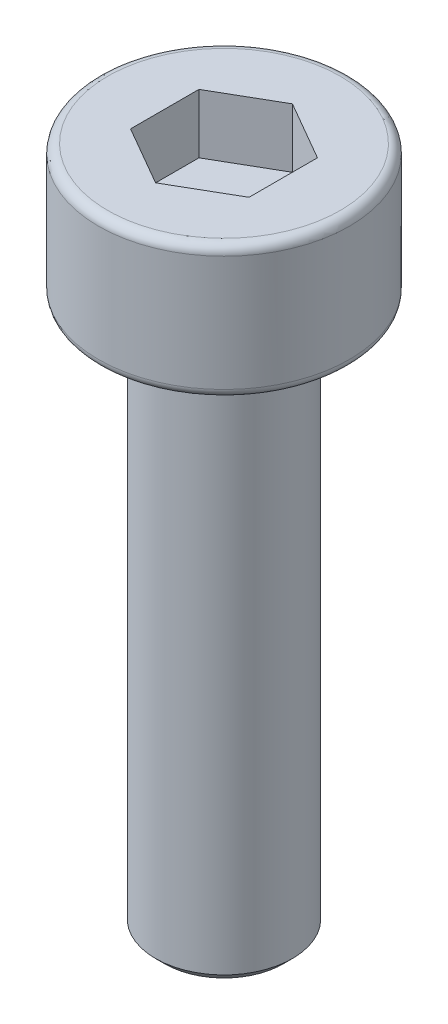
ISO-10303-21;
HEADER;
FILE_DESCRIPTION(('STEP AP214'),'2;1');
FILE_NAME('part.step','',(''),(''),'','','');
FILE_SCHEMA(('AUTOMOTIVE_DESIGN { 1 0 10303 214 1 1 1 1 }'));
ENDSEC;
DATA;
#1=APPLICATION_CONTEXT('core data for automotive mechanical design processes');
#2=APPLICATION_PROTOCOL_DEFINITION('international standard','automotive_design',2000,#1);
#3=PRODUCT_CONTEXT('',#1,'mechanical');
#4=PRODUCT('Part','Part','',(#3));
#5=PRODUCT_RELATED_PRODUCT_CATEGORY('part','',(#4));
#6=PRODUCT_DEFINITION_FORMATION('','',#4);
#7=PRODUCT_DEFINITION_CONTEXT('part definition',#1,'design');
#8=PRODUCT_DEFINITION('design','',#6,#7);
#9=PRODUCT_DEFINITION_SHAPE('','',#8);
#10=(LENGTH_UNIT() NAMED_UNIT(*) SI_UNIT(.MILLI.,.METRE.));
#11=(NAMED_UNIT(*) PLANE_ANGLE_UNIT() SI_UNIT($,.RADIAN.));
#12=(NAMED_UNIT(*) SI_UNIT($,.STERADIAN.) SOLID_ANGLE_UNIT());
#13=UNCERTAINTY_MEASURE_WITH_UNIT(LENGTH_MEASURE(1.E-05),#10,'distance_accuracy_value','');
#14=(GEOMETRIC_REPRESENTATION_CONTEXT(3) GLOBAL_UNCERTAINTY_ASSIGNED_CONTEXT((#13)) GLOBAL_UNIT_ASSIGNED_CONTEXT((#10,
#11,#12)) REPRESENTATION_CONTEXT('',''));
#15=CARTESIAN_POINT('',(0.,0.,0.));
#16=DIRECTION('',(0.,0.,1.));
#17=DIRECTION('',(1.,0.,0.));
#18=AXIS2_PLACEMENT_3D('',#15,#16,#17);
#19=CARTESIAN_POINT('',(0.,0.,0.));
#20=DIRECTION('',(0.,-1.,0.));
#21=DIRECTION('',(0.,0.,-1.));
#22=AXIS2_PLACEMENT_3D('',#19,#20,#21);
#23=PLANE('',#22);
#24=CARTESIAN_POINT('',(0.,0.,0.));
#25=DIRECTION('',(0.,-1.,0.));
#26=DIRECTION('',(0.,0.,-1.));
#27=AXIS2_PLACEMENT_3D('',#24,#25,#26);
#28=CIRCLE('',#27,2.55);
#29=CARTESIAN_POINT('',(0.,0.,-2.55));
#30=VERTEX_POINT('',#29);
#31=EDGE_CURVE('E157',#30,#30,#28,.F.);
#32=ORIENTED_EDGE('',*,*,#31,.T.);
#33=EDGE_LOOP('',(#32));
#34=FACE_BOUND('',#33,.T.);
#35=DIRECTION('',(-0.866025403784438,0.,0.5));
#36=VECTOR('',#35,1.);
#37=CARTESIAN_POINT('',(0.,0.,-1.5));
#38=LINE('',#37,#36);
#39=CARTESIAN_POINT('',(0.,0.,-1.5));
#40=VERTEX_POINT('',#39);
#41=CARTESIAN_POINT('',(-1.29903810567666,0.,-0.75));
#42=VERTEX_POINT('',#41);
#43=EDGE_CURVE('E136',#40,#42,#38,.T.);
#44=ORIENTED_EDGE('',*,*,#43,.F.);
#45=DIRECTION('',(-0.866025403784439,0.,-0.5));
#46=VECTOR('',#45,1.);
#47=CARTESIAN_POINT('',(1.29903810567666,0.,-0.750000000000001));
#48=LINE('',#47,#46);
#49=CARTESIAN_POINT('',(1.29903810567666,0.,-0.750000000000001));
#50=VERTEX_POINT('',#49);
#51=EDGE_CURVE('E62',#50,#40,#48,.T.);
#52=ORIENTED_EDGE('',*,*,#51,.F.);
#53=DIRECTION('',(0.,0.,-1.));
#54=VECTOR('',#53,1.);
#55=CARTESIAN_POINT('',(1.29903810567666,0.,0.75));
#56=LINE('',#55,#54);
#57=CARTESIAN_POINT('',(1.29903810567666,0.,0.75));
#58=VERTEX_POINT('',#57);
#59=EDGE_CURVE('E145',#58,#50,#56,.T.);
#60=ORIENTED_EDGE('',*,*,#59,.F.);
#61=DIRECTION('',(0.866025403784439,0.,-0.5));
#62=VECTOR('',#61,1.);
#63=CARTESIAN_POINT('',(0.,0.,1.5));
#64=LINE('',#63,#62);
#65=CARTESIAN_POINT('',(0.,0.,1.5));
#66=VERTEX_POINT('',#65);
#67=EDGE_CURVE('E143',#66,#58,#64,.T.);
#68=ORIENTED_EDGE('',*,*,#67,.F.);
#69=DIRECTION('',(0.866025403784439,0.,0.5));
#70=VECTOR('',#69,1.);
#71=CARTESIAN_POINT('',(-1.29903810567666,0.,0.75));
#72=LINE('',#71,#70);
#73=CARTESIAN_POINT('',(-1.29903810567666,0.,0.75));
#74=VERTEX_POINT('',#73);
#75=EDGE_CURVE('E110',#74,#66,#72,.T.);
#76=ORIENTED_EDGE('',*,*,#75,.F.);
#77=DIRECTION('',(0.,0.,1.));
#78=VECTOR('',#77,1.);
#79=CARTESIAN_POINT('',(-1.29903810567666,0.,-0.75));
#80=LINE('',#79,#78);
#81=EDGE_CURVE('E139',#42,#74,#80,.T.);
#82=ORIENTED_EDGE('',*,*,#81,.F.);
#83=EDGE_LOOP('',(#44,#52,#60,#68,#76,#82));
#84=FACE_BOUND('',#83,.T.);
#85=ADVANCED_FACE('F47',(#34,#84),#23,.F.);
#86=CARTESIAN_POINT('',(0.,0.,0.));
#87=DIRECTION('',(0.,1.,0.));
#88=DIRECTION('',(0.,0.,1.));
#89=AXIS2_PLACEMENT_3D('',#86,#87,#88);
#90=CYLINDRICAL_SURFACE('',#89,2.75);
#91=CARTESIAN_POINT('',(0.,-0.2,0.));
#92=DIRECTION('',(0.,-1.,0.));
#93=DIRECTION('',(0.,0.,-1.));
#94=AXIS2_PLACEMENT_3D('',#91,#92,#93);
#95=CIRCLE('',#94,2.75);
#96=CARTESIAN_POINT('',(0.,-0.2,-2.75));
#97=VERTEX_POINT('',#96);
#98=EDGE_CURVE('E163',#97,#97,#95,.T.);
#99=ORIENTED_EDGE('',*,*,#98,.T.);
#100=EDGE_LOOP('',(#99));
#101=FACE_BOUND('',#100,.T.);
#102=CARTESIAN_POINT('',(0.,-2.73,0.));
#103=DIRECTION('',(0.,1.,0.));
#104=DIRECTION('',(0.,0.,1.));
#105=AXIS2_PLACEMENT_3D('',#102,#103,#104);
#106=CIRCLE('',#105,2.75);
#107=CARTESIAN_POINT('',(0.,-2.73,2.75));
#108=VERTEX_POINT('',#107);
#109=EDGE_CURVE('E160',#108,#108,#106,.T.);
#110=ORIENTED_EDGE('',*,*,#109,.T.);
#111=EDGE_LOOP('',(#110));
#112=FACE_BOUND('',#111,.T.);
#113=ADVANCED_FACE('F185',(#101,#112),#90,.T.);
#114=CARTESIAN_POINT('',(2.75,-2.93,0.));
#115=DIRECTION('',(0.,1.,0.));
#116=DIRECTION('',(0.,0.,1.));
#117=AXIS2_PLACEMENT_3D('',#114,#115,#116);
#118=PLANE('',#117);
#119=CARTESIAN_POINT('',(0.,-2.93,0.));
#120=DIRECTION('',(0.,1.,0.));
#121=DIRECTION('',(0.,0.,1.));
#122=AXIS2_PLACEMENT_3D('',#119,#120,#121);
#123=CIRCLE('',#122,2.55);
#124=CARTESIAN_POINT('',(0.,-2.93,2.55));
#125=VERTEX_POINT('',#124);
#126=EDGE_CURVE('E166',#125,#125,#123,.F.);
#127=ORIENTED_EDGE('',*,*,#126,.T.);
#128=EDGE_LOOP('',(#127));
#129=FACE_BOUND('',#128,.T.);
#130=CARTESIAN_POINT('',(0.,-2.93,0.));
#131=DIRECTION('',(0.,1.,0.));
#132=DIRECTION('',(0.,0.,1.));
#133=AXIS2_PLACEMENT_3D('',#130,#131,#132);
#134=CIRCLE('',#133,1.5);
#135=CARTESIAN_POINT('',(0.,-2.93,1.5));
#136=VERTEX_POINT('',#135);
#137=EDGE_CURVE('E149',#136,#136,#134,.T.);
#138=ORIENTED_EDGE('',*,*,#137,.T.);
#139=EDGE_LOOP('',(#138));
#140=FACE_BOUND('',#139,.T.);
#141=ADVANCED_FACE('F192',(#129,#140),#118,.F.);
#142=CARTESIAN_POINT('',(0.,0.,0.));
#143=DIRECTION('',(0.,1.,0.));
#144=DIRECTION('',(0.,0.,1.));
#145=AXIS2_PLACEMENT_3D('',#142,#143,#144);
#146=CYLINDRICAL_SURFACE('',#145,1.5);
#147=CARTESIAN_POINT('',(0.,-14.73,0.));
#148=DIRECTION('',(0.,1.,0.));
#149=DIRECTION('',(0.,0.,1.));
#150=AXIS2_PLACEMENT_3D('',#147,#148,#149);
#151=CIRCLE('',#150,1.5);
#152=CARTESIAN_POINT('',(0.,-14.73,1.5));
#153=VERTEX_POINT('',#152);
#154=EDGE_CURVE('E55',#153,#153,#151,.T.);
#155=ORIENTED_EDGE('',*,*,#154,.T.);
#156=EDGE_LOOP('',(#155));
#157=FACE_BOUND('',#156,.T.);
#158=ORIENTED_EDGE('',*,*,#137,.F.);
#159=EDGE_LOOP('',(#158));
#160=FACE_BOUND('',#159,.T.);
#161=ADVANCED_FACE('F171',(#157,#160),#146,.T.);
#162=CARTESIAN_POINT('',(1.5,-14.93,0.));
#163=DIRECTION('',(0.,1.,0.));
#164=DIRECTION('',(0.,0.,1.));
#165=AXIS2_PLACEMENT_3D('',#162,#163,#164);
#166=PLANE('',#165);
#167=CARTESIAN_POINT('',(0.,-14.93,0.));
#168=DIRECTION('',(0.,1.,0.));
#169=DIRECTION('',(0.,0.,1.));
#170=AXIS2_PLACEMENT_3D('',#167,#168,#169);
#171=CIRCLE('',#170,1.3);
#172=CARTESIAN_POINT('',(0.,-14.93,1.3));
#173=VERTEX_POINT('',#172);
#174=EDGE_CURVE('E11',#173,#173,#171,.F.);
#175=ORIENTED_EDGE('',*,*,#174,.T.);
#176=EDGE_LOOP('',(#175));
#177=FACE_BOUND('',#176,.T.);
#178=ADVANCED_FACE('F231',(#177),#166,.F.);
#179=CARTESIAN_POINT('',(1.29903810567666,-1.3,-0.750000000000001));
#180=DIRECTION('',(0.5,0.,-0.866025403784439));
#181=DIRECTION('',(-0.866025403784439,0.,-0.5));
#182=AXIS2_PLACEMENT_3D('',#179,#180,#181);
#183=PLANE('',#182);
#184=ORIENTED_EDGE('',*,*,#51,.T.);
#185=DIRECTION('',(0.,1.,0.));
#186=VECTOR('',#185,1.);
#187=CARTESIAN_POINT('',(0.,-1.3,-1.5));
#188=LINE('',#187,#186);
#189=CARTESIAN_POINT('',(0.,-1.3,-1.5));
#190=VERTEX_POINT('',#189);
#191=EDGE_CURVE('E92',#190,#40,#188,.T.);
#192=ORIENTED_EDGE('',*,*,#191,.F.);
#193=DIRECTION('',(-0.866025403784439,0.,-0.5));
#194=VECTOR('',#193,1.);
#195=CARTESIAN_POINT('',(1.29903810567666,-1.3,-0.750000000000001));
#196=LINE('',#195,#194);
#197=CARTESIAN_POINT('',(1.29903810567666,-1.3,-0.750000000000001));
#198=VERTEX_POINT('',#197);
#199=EDGE_CURVE('E147',#198,#190,#196,.T.);
#200=ORIENTED_EDGE('',*,*,#199,.F.);
#201=DIRECTION('',(0.,1.,0.));
#202=VECTOR('',#201,1.);
#203=CARTESIAN_POINT('',(1.29903810567666,-1.3,-0.750000000000001));
#204=LINE('',#203,#202);
#205=EDGE_CURVE('E70',#198,#50,#204,.T.);
#206=ORIENTED_EDGE('',*,*,#205,.T.);
#207=EDGE_LOOP('',(#184,#192,#200,#206));
#208=FACE_BOUND('',#207,.T.);
#209=ADVANCED_FACE('F221',(#208),#183,.F.);
#210=CARTESIAN_POINT('',(1.29903810567666,-1.3,0.75));
#211=DIRECTION('',(1.,0.,0.));
#212=DIRECTION('',(0.,0.,-1.));
#213=AXIS2_PLACEMENT_3D('',#210,#211,#212);
#214=PLANE('',#213);
#215=ORIENTED_EDGE('',*,*,#59,.T.);
#216=ORIENTED_EDGE('',*,*,#205,.F.);
#217=DIRECTION('',(0.,0.,-1.));
#218=VECTOR('',#217,1.);
#219=CARTESIAN_POINT('',(1.29903810567666,-1.3,0.75));
#220=LINE('',#219,#218);
#221=CARTESIAN_POINT('',(1.29903810567666,-1.3,0.75));
#222=VERTEX_POINT('',#221);
#223=EDGE_CURVE('E122',#222,#198,#220,.T.);
#224=ORIENTED_EDGE('',*,*,#223,.F.);
#225=DIRECTION('',(0.,1.,0.));
#226=VECTOR('',#225,1.);
#227=CARTESIAN_POINT('',(1.29903810567666,-1.3,0.75));
#228=LINE('',#227,#226);
#229=EDGE_CURVE('E114',#222,#58,#228,.T.);
#230=ORIENTED_EDGE('',*,*,#229,.T.);
#231=EDGE_LOOP('',(#215,#216,#224,#230));
#232=FACE_BOUND('',#231,.T.);
#233=ADVANCED_FACE('F218',(#232),#214,.F.);
#234=CARTESIAN_POINT('',(0.,-1.3,1.5));
#235=DIRECTION('',(0.5,0.,0.866025403784439));
#236=DIRECTION('',(0.866025403784439,0.,-0.5));
#237=AXIS2_PLACEMENT_3D('',#234,#235,#236);
#238=PLANE('',#237);
#239=ORIENTED_EDGE('',*,*,#67,.T.);
#240=ORIENTED_EDGE('',*,*,#229,.F.);
#241=DIRECTION('',(0.866025403784439,0.,-0.5));
#242=VECTOR('',#241,1.);
#243=CARTESIAN_POINT('',(0.,-1.3,1.5));
#244=LINE('',#243,#242);
#245=CARTESIAN_POINT('',(0.,-1.3,1.5));
#246=VERTEX_POINT('',#245);
#247=EDGE_CURVE('E118',#246,#222,#244,.T.);
#248=ORIENTED_EDGE('',*,*,#247,.F.);
#249=DIRECTION('',(0.,1.,0.));
#250=VECTOR('',#249,1.);
#251=CARTESIAN_POINT('',(0.,-1.3,1.5));
#252=LINE('',#251,#250);
#253=EDGE_CURVE('E103',#246,#66,#252,.T.);
#254=ORIENTED_EDGE('',*,*,#253,.T.);
#255=EDGE_LOOP('',(#239,#240,#248,#254));
#256=FACE_BOUND('',#255,.T.);
#257=ADVANCED_FACE('F119',(#256),#238,.F.);
#258=CARTESIAN_POINT('',(-1.29903810567666,-1.3,0.75));
#259=DIRECTION('',(-0.5,0.,0.866025403784439));
#260=DIRECTION('',(0.866025403784439,0.,0.5));
#261=AXIS2_PLACEMENT_3D('',#258,#259,#260);
#262=PLANE('',#261);
#263=ORIENTED_EDGE('',*,*,#75,.T.);
#264=ORIENTED_EDGE('',*,*,#253,.F.);
#265=DIRECTION('',(0.866025403784439,0.,0.5));
#266=VECTOR('',#265,1.);
#267=CARTESIAN_POINT('',(-1.29903810567666,-1.3,0.75));
#268=LINE('',#267,#266);
#269=CARTESIAN_POINT('',(-1.29903810567666,-1.3,0.75));
#270=VERTEX_POINT('',#269);
#271=EDGE_CURVE('E107',#270,#246,#268,.T.);
#272=ORIENTED_EDGE('',*,*,#271,.F.);
#273=DIRECTION('',(0.,1.,0.));
#274=VECTOR('',#273,1.);
#275=CARTESIAN_POINT('',(-1.29903810567666,-1.3,0.75));
#276=LINE('',#275,#274);
#277=EDGE_CURVE('E115',#270,#74,#276,.T.);
#278=ORIENTED_EDGE('',*,*,#277,.T.);
#279=EDGE_LOOP('',(#263,#264,#272,#278));
#280=FACE_BOUND('',#279,.T.);
#281=ADVANCED_FACE('F105',(#280),#262,.F.);
#282=CARTESIAN_POINT('',(-1.29903810567666,-1.3,-0.75));
#283=DIRECTION('',(-1.,0.,0.));
#284=DIRECTION('',(0.,0.,1.));
#285=AXIS2_PLACEMENT_3D('',#282,#283,#284);
#286=PLANE('',#285);
#287=ORIENTED_EDGE('',*,*,#81,.T.);
#288=ORIENTED_EDGE('',*,*,#277,.F.);
#289=DIRECTION('',(0.,0.,1.));
#290=VECTOR('',#289,1.);
#291=CARTESIAN_POINT('',(-1.29903810567666,-1.3,-0.75));
#292=LINE('',#291,#290);
#293=CARTESIAN_POINT('',(-1.29903810567666,-1.3,-0.75));
#294=VERTEX_POINT('',#293);
#295=EDGE_CURVE('E128',#294,#270,#292,.T.);
#296=ORIENTED_EDGE('',*,*,#295,.F.);
#297=DIRECTION('',(0.,1.,0.));
#298=VECTOR('',#297,1.);
#299=CARTESIAN_POINT('',(-1.29903810567666,-1.3,-0.75));
#300=LINE('',#299,#298);
#301=EDGE_CURVE('E152',#294,#42,#300,.T.);
#302=ORIENTED_EDGE('',*,*,#301,.T.);
#303=EDGE_LOOP('',(#287,#288,#296,#302));
#304=FACE_BOUND('',#303,.T.);
#305=ADVANCED_FACE('F214',(#304),#286,.F.);
#306=CARTESIAN_POINT('',(0.,-1.3,-1.5));
#307=DIRECTION('',(-0.5,0.,-0.866025403784438));
#308=DIRECTION('',(-0.866025403784439,0.,0.5));
#309=AXIS2_PLACEMENT_3D('',#306,#307,#308);
#310=PLANE('',#309);
#311=ORIENTED_EDGE('',*,*,#43,.T.);
#312=ORIENTED_EDGE('',*,*,#301,.F.);
#313=DIRECTION('',(-0.866025403784438,0.,0.5));
#314=VECTOR('',#313,1.);
#315=CARTESIAN_POINT('',(0.,-1.3,-1.5));
#316=LINE('',#315,#314);
#317=EDGE_CURVE('E130',#190,#294,#316,.T.);
#318=ORIENTED_EDGE('',*,*,#317,.F.);
#319=ORIENTED_EDGE('',*,*,#191,.T.);
#320=EDGE_LOOP('',(#311,#312,#318,#319));
#321=FACE_BOUND('',#320,.T.);
#322=ADVANCED_FACE('F203',(#321),#310,.F.);
#323=CARTESIAN_POINT('',(0.,-1.3,0.));
#324=DIRECTION('',(0.,1.,0.));
#325=DIRECTION('',(0.,0.,1.));
#326=AXIS2_PLACEMENT_3D('',#323,#324,#325);
#327=PLANE('',#326);
#328=ORIENTED_EDGE('',*,*,#199,.T.);
#329=ORIENTED_EDGE('',*,*,#317,.T.);
#330=ORIENTED_EDGE('',*,*,#295,.T.);
#331=ORIENTED_EDGE('',*,*,#271,.T.);
#332=ORIENTED_EDGE('',*,*,#247,.T.);
#333=ORIENTED_EDGE('',*,*,#223,.T.);
#334=EDGE_LOOP('',(#328,#329,#330,#331,#332,#333));
#335=FACE_BOUND('',#334,.T.);
#336=ADVANCED_FACE('F125',(#335),#327,.T.);
#337=CARTESIAN_POINT('',(0.,-0.2,0.));
#338=DIRECTION('',(0.,-1.,0.));
#339=DIRECTION('',(0.,0.,-1.));
#340=AXIS2_PLACEMENT_3D('',#337,#338,#339);
#341=TOROIDAL_SURFACE('',#340,2.55,0.2);
#342=ORIENTED_EDGE('',*,*,#98,.F.);
#343=EDGE_LOOP('',(#342));
#344=FACE_BOUND('',#343,.T.);
#345=ORIENTED_EDGE('',*,*,#31,.F.);
#346=EDGE_LOOP('',(#345));
#347=FACE_BOUND('',#346,.T.);
#348=ADVANCED_FACE('F181',(#344,#347),#341,.T.);
#349=CARTESIAN_POINT('',(0.,-2.73,0.));
#350=DIRECTION('',(0.,1.,0.));
#351=DIRECTION('',(0.,0.,1.));
#352=AXIS2_PLACEMENT_3D('',#349,#350,#351);
#353=TOROIDAL_SURFACE('',#352,2.55,0.2);
#354=ORIENTED_EDGE('',*,*,#126,.F.);
#355=EDGE_LOOP('',(#354));
#356=FACE_BOUND('',#355,.T.);
#357=ORIENTED_EDGE('',*,*,#109,.F.);
#358=EDGE_LOOP('',(#357));
#359=FACE_BOUND('',#358,.T.);
#360=ADVANCED_FACE('F175',(#356,#359),#353,.T.);
#361=CARTESIAN_POINT('',(0.,-14.73,0.));
#362=DIRECTION('',(0.,1.,0.));
#363=DIRECTION('',(0.,0.,1.));
#364=AXIS2_PLACEMENT_3D('',#361,#362,#363);
#365=CONICAL_SURFACE('',#364,1.5,0.785398163397448);
#366=ORIENTED_EDGE('',*,*,#174,.F.);
#367=EDGE_LOOP('',(#366));
#368=FACE_BOUND('',#367,.T.);
#369=ORIENTED_EDGE('',*,*,#154,.F.);
#370=EDGE_LOOP('',(#369));
#371=FACE_BOUND('',#370,.T.);
#372=ADVANCED_FACE('F49',(#368,#371),#365,.T.);
#373=CLOSED_SHELL('',(#85,#113,#141,#161,#178,#209,#233,#257,#281,#305,#322,#336,#348,#360,#372));
#374=MANIFOLD_SOLID_BREP('B2',#373);
#375=ADVANCED_BREP_SHAPE_REPRESENTATION('',(#18,#374),#14);
#376=SHAPE_DEFINITION_REPRESENTATION(#9,#375);
ENDSEC;
END-ISO-10303-21;
